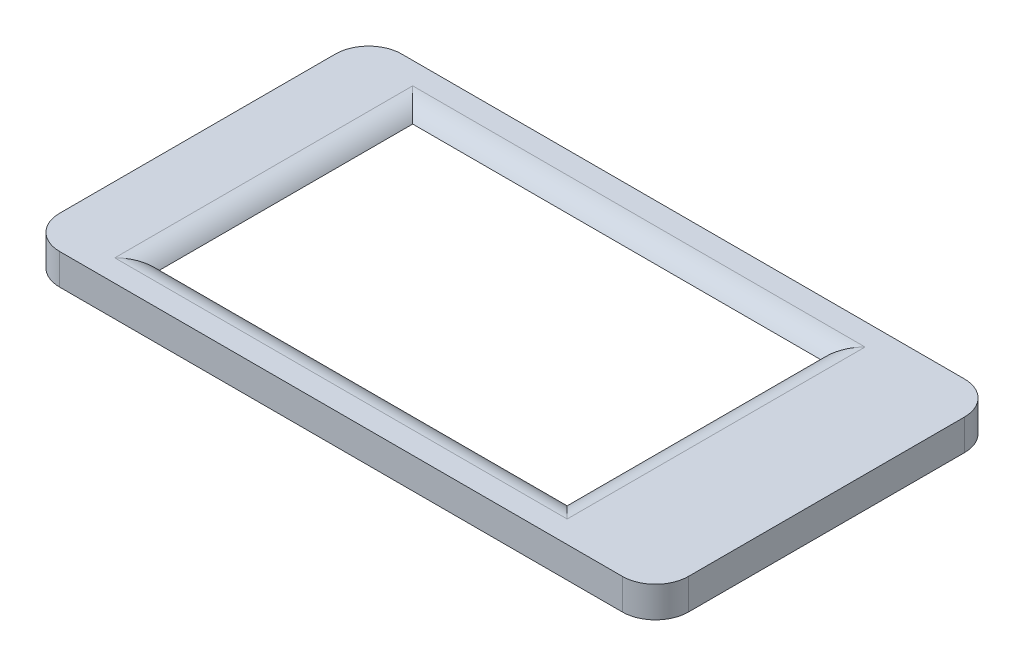
ISO-10303-21;
HEADER;
FILE_DESCRIPTION(('STEP AP214'),'2;1');
FILE_NAME('part.step','',(''),(''),'','','');
FILE_SCHEMA(('AUTOMOTIVE_DESIGN { 1 0 10303 214 1 1 1 1 }'));
ENDSEC;
DATA;
#1=APPLICATION_CONTEXT('core data for automotive mechanical design processes');
#2=APPLICATION_PROTOCOL_DEFINITION('international standard','automotive_design',2000,#1);
#3=PRODUCT_CONTEXT('',#1,'mechanical');
#4=PRODUCT('Part','Part','',(#3));
#5=PRODUCT_RELATED_PRODUCT_CATEGORY('part','',(#4));
#6=PRODUCT_DEFINITION_FORMATION('','',#4);
#7=PRODUCT_DEFINITION_CONTEXT('part definition',#1,'design');
#8=PRODUCT_DEFINITION('design','',#6,#7);
#9=PRODUCT_DEFINITION_SHAPE('','',#8);
#10=(LENGTH_UNIT() NAMED_UNIT(*) SI_UNIT(.MILLI.,.METRE.));
#11=(NAMED_UNIT(*) PLANE_ANGLE_UNIT() SI_UNIT($,.RADIAN.));
#12=(NAMED_UNIT(*) SI_UNIT($,.STERADIAN.) SOLID_ANGLE_UNIT());
#13=UNCERTAINTY_MEASURE_WITH_UNIT(LENGTH_MEASURE(1.E-05),#10,'distance_accuracy_value','');
#14=(GEOMETRIC_REPRESENTATION_CONTEXT(3) GLOBAL_UNCERTAINTY_ASSIGNED_CONTEXT((#13)) GLOBAL_UNIT_ASSIGNED_CONTEXT((#10,
#11,#12)) REPRESENTATION_CONTEXT('',''));
#15=CARTESIAN_POINT('',(0.,0.,0.));
#16=DIRECTION('',(0.,0.,1.));
#17=DIRECTION('',(1.,0.,0.));
#18=AXIS2_PLACEMENT_3D('',#15,#16,#17);
#19=CARTESIAN_POINT('',(55.,5.6,-31.));
#20=DIRECTION('',(-1.,0.,0.));
#21=DIRECTION('',(0.,0.,1.));
#22=AXIS2_PLACEMENT_3D('',#19,#20,#21);
#23=PLANE('',#22);
#24=DIRECTION('',(0.,0.,-1.));
#25=VECTOR('',#24,1.);
#26=CARTESIAN_POINT('',(55.,5.6,-31.));
#27=LINE('',#26,#25);
#28=CARTESIAN_POINT('',(55.,5.6,25.));
#29=VERTEX_POINT('',#28);
#30=CARTESIAN_POINT('',(55.,5.6,-25.));
#31=VERTEX_POINT('',#30);
#32=EDGE_CURVE('E239',#29,#31,#27,.T.);
#33=ORIENTED_EDGE('',*,*,#32,.F.);
#34=DIRECTION('',(0.,-1.,0.));
#35=VECTOR('',#34,1.);
#36=CARTESIAN_POINT('',(55.,5.6,25.));
#37=LINE('',#36,#35);
#38=CARTESIAN_POINT('',(55.,0.,25.));
#39=VERTEX_POINT('',#38);
#40=EDGE_CURVE('E11',#29,#39,#37,.T.);
#41=ORIENTED_EDGE('',*,*,#40,.T.);
#42=DIRECTION('',(0.,0.,-1.));
#43=VECTOR('',#42,1.);
#44=CARTESIAN_POINT('',(55.,0.,-31.));
#45=LINE('',#44,#43);
#46=CARTESIAN_POINT('',(55.,0.,-25.));
#47=VERTEX_POINT('',#46);
#48=EDGE_CURVE('E236',#39,#47,#45,.T.);
#49=ORIENTED_EDGE('',*,*,#48,.T.);
#50=DIRECTION('',(0.,-1.,0.));
#51=VECTOR('',#50,1.);
#52=CARTESIAN_POINT('',(55.,5.6,-25.));
#53=LINE('',#52,#51);
#54=EDGE_CURVE('E45',#47,#31,#53,.F.);
#55=ORIENTED_EDGE('',*,*,#54,.T.);
#56=EDGE_LOOP('',(#33,#41,#49,#55));
#57=FACE_BOUND('',#56,.T.);
#58=ADVANCED_FACE('F37',(#57),#23,.F.);
#59=CARTESIAN_POINT('',(-59.,5.6,-31.));
#60=DIRECTION('',(0.,0.,1.));
#61=DIRECTION('',(1.,0.,0.));
#62=AXIS2_PLACEMENT_3D('',#59,#60,#61);
#63=PLANE('',#62);
#64=DIRECTION('',(-1.,0.,0.));
#65=VECTOR('',#64,1.);
#66=CARTESIAN_POINT('',(-59.,0.,-31.));
#67=LINE('',#66,#65);
#68=CARTESIAN_POINT('',(49.,0.,-31.));
#69=VERTEX_POINT('',#68);
#70=CARTESIAN_POINT('',(-53.,0.,-31.));
#71=VERTEX_POINT('',#70);
#72=EDGE_CURVE('E253',#69,#71,#67,.T.);
#73=ORIENTED_EDGE('',*,*,#72,.T.);
#74=DIRECTION('',(0.,-1.,0.));
#75=VECTOR('',#74,1.);
#76=CARTESIAN_POINT('',(-53.,5.6,-31.));
#77=LINE('',#76,#75);
#78=CARTESIAN_POINT('',(-53.,5.6,-31.));
#79=VERTEX_POINT('',#78);
#80=EDGE_CURVE('E52',#71,#79,#77,.F.);
#81=ORIENTED_EDGE('',*,*,#80,.T.);
#82=DIRECTION('',(-1.,0.,0.));
#83=VECTOR('',#82,1.);
#84=CARTESIAN_POINT('',(-59.,5.6,-31.));
#85=LINE('',#84,#83);
#86=CARTESIAN_POINT('',(49.,5.6,-31.));
#87=VERTEX_POINT('',#86);
#88=EDGE_CURVE('E241',#87,#79,#85,.T.);
#89=ORIENTED_EDGE('',*,*,#88,.F.);
#90=DIRECTION('',(0.,-1.,0.));
#91=VECTOR('',#90,1.);
#92=CARTESIAN_POINT('',(49.,5.6,-31.));
#93=LINE('',#92,#91);
#94=EDGE_CURVE('E296',#87,#69,#93,.T.);
#95=ORIENTED_EDGE('',*,*,#94,.T.);
#96=EDGE_LOOP('',(#73,#81,#89,#95));
#97=FACE_BOUND('',#96,.T.);
#98=ADVANCED_FACE('F309',(#97),#63,.F.);
#99=CARTESIAN_POINT('',(-59.,5.6,-31.));
#100=DIRECTION('',(1.,0.,0.));
#101=DIRECTION('',(0.,0.,-1.));
#102=AXIS2_PLACEMENT_3D('',#99,#100,#101);
#103=PLANE('',#102);
#104=DIRECTION('',(0.,0.,1.));
#105=VECTOR('',#104,1.);
#106=CARTESIAN_POINT('',(-59.,0.,-31.));
#107=LINE('',#106,#105);
#108=CARTESIAN_POINT('',(-59.,0.,-25.));
#109=VERTEX_POINT('',#108);
#110=CARTESIAN_POINT('',(-59.,0.,25.));
#111=VERTEX_POINT('',#110);
#112=EDGE_CURVE('E255',#109,#111,#107,.T.);
#113=ORIENTED_EDGE('',*,*,#112,.T.);
#114=DIRECTION('',(0.,-1.,0.));
#115=VECTOR('',#114,1.);
#116=CARTESIAN_POINT('',(-59.,5.6,25.));
#117=LINE('',#116,#115);
#118=CARTESIAN_POINT('',(-59.,5.6,25.));
#119=VERTEX_POINT('',#118);
#120=EDGE_CURVE('E287',#111,#119,#117,.F.);
#121=ORIENTED_EDGE('',*,*,#120,.T.);
#122=DIRECTION('',(0.,0.,1.));
#123=VECTOR('',#122,1.);
#124=CARTESIAN_POINT('',(-59.,5.6,-31.));
#125=LINE('',#124,#123);
#126=CARTESIAN_POINT('',(-59.,5.6,-25.));
#127=VERTEX_POINT('',#126);
#128=EDGE_CURVE('E244',#127,#119,#125,.T.);
#129=ORIENTED_EDGE('',*,*,#128,.F.);
#130=DIRECTION('',(0.,-1.,0.));
#131=VECTOR('',#130,1.);
#132=CARTESIAN_POINT('',(-59.,5.6,-25.));
#133=LINE('',#132,#131);
#134=EDGE_CURVE('E284',#127,#109,#133,.T.);
#135=ORIENTED_EDGE('',*,*,#134,.T.);
#136=EDGE_LOOP('',(#113,#121,#129,#135));
#137=FACE_BOUND('',#136,.T.);
#138=ADVANCED_FACE('F320',(#137),#103,.F.);
#139=CARTESIAN_POINT('',(-59.,5.6,31.));
#140=DIRECTION('',(0.,0.,-1.));
#141=DIRECTION('',(-1.,0.,0.));
#142=AXIS2_PLACEMENT_3D('',#139,#140,#141);
#143=PLANE('',#142);
#144=DIRECTION('',(1.,0.,0.));
#145=VECTOR('',#144,1.);
#146=CARTESIAN_POINT('',(-59.,5.6,31.));
#147=LINE('',#146,#145);
#148=CARTESIAN_POINT('',(-53.,5.6,31.));
#149=VERTEX_POINT('',#148);
#150=CARTESIAN_POINT('',(49.,5.6,31.));
#151=VERTEX_POINT('',#150);
#152=EDGE_CURVE('E247',#149,#151,#147,.T.);
#153=ORIENTED_EDGE('',*,*,#152,.F.);
#154=DIRECTION('',(0.,-1.,0.));
#155=VECTOR('',#154,1.);
#156=CARTESIAN_POINT('',(-53.,5.6,31.));
#157=LINE('',#156,#155);
#158=CARTESIAN_POINT('',(-53.,0.,31.));
#159=VERTEX_POINT('',#158);
#160=EDGE_CURVE('E273',#149,#159,#157,.T.);
#161=ORIENTED_EDGE('',*,*,#160,.T.);
#162=DIRECTION('',(1.,0.,0.));
#163=VECTOR('',#162,1.);
#164=CARTESIAN_POINT('',(-59.,0.,31.));
#165=LINE('',#164,#163);
#166=CARTESIAN_POINT('',(49.,0.,31.));
#167=VERTEX_POINT('',#166);
#168=EDGE_CURVE('E242',#159,#167,#165,.T.);
#169=ORIENTED_EDGE('',*,*,#168,.T.);
#170=DIRECTION('',(0.,-1.,0.));
#171=VECTOR('',#170,1.);
#172=CARTESIAN_POINT('',(49.,5.6,31.));
#173=LINE('',#172,#171);
#174=EDGE_CURVE('E267',#167,#151,#173,.F.);
#175=ORIENTED_EDGE('',*,*,#174,.T.);
#176=EDGE_LOOP('',(#153,#161,#169,#175));
#177=FACE_BOUND('',#176,.T.);
#178=ADVANCED_FACE('F328',(#177),#143,.F.);
#179=CARTESIAN_POINT('',(0.,5.6,0.));
#180=DIRECTION('',(0.,1.,0.));
#181=DIRECTION('',(0.,0.,1.));
#182=AXIS2_PLACEMENT_3D('',#179,#180,#181);
#183=PLANE('',#182);
#184=DIRECTION('',(-1.,0.,0.));
#185=VECTOR('',#184,1.);
#186=CARTESIAN_POINT('',(-43.,5.6,27.));
#187=LINE('',#186,#185);
#188=CARTESIAN_POINT('',(35.,5.6,27.));
#189=VERTEX_POINT('',#188);
#190=CARTESIAN_POINT('',(-47.,5.6,27.));
#191=VERTEX_POINT('',#190);
#192=EDGE_CURVE('E262',#189,#191,#187,.T.);
#193=ORIENTED_EDGE('',*,*,#192,.T.);
#194=DIRECTION('',(0.,0.,-1.));
#195=VECTOR('',#194,1.);
#196=CARTESIAN_POINT('',(-47.,5.6,-23.));
#197=LINE('',#196,#195);
#198=CARTESIAN_POINT('',(-47.,5.6,-27.));
#199=VERTEX_POINT('',#198);
#200=EDGE_CURVE('E264',#191,#199,#197,.T.);
#201=ORIENTED_EDGE('',*,*,#200,.T.);
#202=DIRECTION('',(1.,0.,0.));
#203=VECTOR('',#202,1.);
#204=CARTESIAN_POINT('',(31.,5.6,-27.));
#205=LINE('',#204,#203);
#206=CARTESIAN_POINT('',(35.,5.6,-27.));
#207=VERTEX_POINT('',#206);
#208=EDGE_CURVE('E250',#199,#207,#205,.T.);
#209=ORIENTED_EDGE('',*,*,#208,.T.);
#210=DIRECTION('',(0.,0.,1.));
#211=VECTOR('',#210,1.);
#212=CARTESIAN_POINT('',(35.,5.6,23.));
#213=LINE('',#212,#211);
#214=EDGE_CURVE('E169',#207,#189,#213,.T.);
#215=ORIENTED_EDGE('',*,*,#214,.T.);
#216=EDGE_LOOP('',(#193,#201,#209,#215));
#217=FACE_BOUND('',#216,.T.);
#218=ORIENTED_EDGE('',*,*,#128,.T.);
#219=CARTESIAN_POINT('',(-53.,5.6,25.));
#220=DIRECTION('',(0.,1.,0.));
#221=DIRECTION('',(0.,0.,1.));
#222=AXIS2_PLACEMENT_3D('',#219,#220,#221);
#223=CIRCLE('',#222,6.);
#224=EDGE_CURVE('E294',#119,#149,#223,.T.);
#225=ORIENTED_EDGE('',*,*,#224,.T.);
#226=ORIENTED_EDGE('',*,*,#152,.T.);
#227=CARTESIAN_POINT('',(49.,5.6,25.));
#228=DIRECTION('',(0.,1.,0.));
#229=DIRECTION('',(0.,0.,1.));
#230=AXIS2_PLACEMENT_3D('',#227,#228,#229);
#231=CIRCLE('',#230,6.);
#232=EDGE_CURVE('E290',#151,#29,#231,.T.);
#233=ORIENTED_EDGE('',*,*,#232,.T.);
#234=ORIENTED_EDGE('',*,*,#32,.T.);
#235=CARTESIAN_POINT('',(49.,5.6,-25.));
#236=DIRECTION('',(0.,1.,0.));
#237=DIRECTION('',(0.,0.,1.));
#238=AXIS2_PLACEMENT_3D('',#235,#236,#237);
#239=CIRCLE('',#238,6.);
#240=EDGE_CURVE('E59',#31,#87,#239,.T.);
#241=ORIENTED_EDGE('',*,*,#240,.T.);
#242=ORIENTED_EDGE('',*,*,#88,.T.);
#243=CARTESIAN_POINT('',(-53.,5.6,-25.));
#244=DIRECTION('',(0.,1.,0.));
#245=DIRECTION('',(0.,0.,1.));
#246=AXIS2_PLACEMENT_3D('',#243,#244,#245);
#247=CIRCLE('',#246,6.);
#248=EDGE_CURVE('E292',#79,#127,#247,.T.);
#249=ORIENTED_EDGE('',*,*,#248,.T.);
#250=EDGE_LOOP('',(#218,#225,#226,#233,#234,#241,#242,#249));
#251=FACE_BOUND('',#250,.T.);
#252=ADVANCED_FACE('F305',(#217,#251),#183,.T.);
#253=CARTESIAN_POINT('',(0.,0.,0.));
#254=DIRECTION('',(0.,1.,0.));
#255=DIRECTION('',(0.,0.,1.));
#256=AXIS2_PLACEMENT_3D('',#253,#254,#255);
#257=PLANE('',#256);
#258=DIRECTION('',(-1.,0.,0.));
#259=VECTOR('',#258,1.);
#260=CARTESIAN_POINT('',(35.,0.,29.));
#261=LINE('',#260,#259);
#262=CARTESIAN_POINT('',(35.,0.,29.));
#263=VERTEX_POINT('',#262);
#264=CARTESIAN_POINT('',(-50.,0.,29.));
#265=VERTEX_POINT('',#264);
#266=EDGE_CURVE('E198',#263,#265,#261,.T.);
#267=ORIENTED_EDGE('',*,*,#266,.F.);
#268=DIRECTION('',(0.,0.,1.));
#269=VECTOR('',#268,1.);
#270=CARTESIAN_POINT('',(35.,0.,-29.));
#271=LINE('',#270,#269);
#272=CARTESIAN_POINT('',(35.,0.,-29.));
#273=VERTEX_POINT('',#272);
#274=EDGE_CURVE('E182',#273,#263,#271,.T.);
#275=ORIENTED_EDGE('',*,*,#274,.F.);
#276=DIRECTION('',(1.,0.,0.));
#277=VECTOR('',#276,1.);
#278=CARTESIAN_POINT('',(35.,0.,-29.));
#279=LINE('',#278,#277);
#280=CARTESIAN_POINT('',(-50.,0.,-29.));
#281=VERTEX_POINT('',#280);
#282=EDGE_CURVE('E187',#281,#273,#279,.T.);
#283=ORIENTED_EDGE('',*,*,#282,.F.);
#284=DIRECTION('',(0.,0.,-1.));
#285=VECTOR('',#284,1.);
#286=CARTESIAN_POINT('',(-50.,0.,-29.));
#287=LINE('',#286,#285);
#288=EDGE_CURVE('E201',#265,#281,#287,.T.);
#289=ORIENTED_EDGE('',*,*,#288,.F.);
#290=EDGE_LOOP('',(#267,#275,#283,#289));
#291=FACE_BOUND('',#290,.T.);
#292=CARTESIAN_POINT('',(39.,0.,-21.));
#293=DIRECTION('',(0.,-1.,0.));
#294=DIRECTION('',(0.,0.,1.));
#295=AXIS2_PLACEMENT_3D('',#292,#293,#294);
#296=CIRCLE('',#295,3.);
#297=CARTESIAN_POINT('',(39.,0.,-18.));
#298=VERTEX_POINT('',#297);
#299=EDGE_CURVE('E208',#298,#298,#296,.T.);
#300=ORIENTED_EDGE('',*,*,#299,.F.);
#301=EDGE_LOOP('',(#300));
#302=FACE_BOUND('',#301,.T.);
#303=CARTESIAN_POINT('',(39.,0.,21.));
#304=DIRECTION('',(0.,-1.,0.));
#305=DIRECTION('',(0.,0.,-1.));
#306=AXIS2_PLACEMENT_3D('',#303,#304,#305);
#307=CIRCLE('',#306,3.);
#308=CARTESIAN_POINT('',(39.,0.,18.));
#309=VERTEX_POINT('',#308);
#310=EDGE_CURVE('E218',#309,#309,#307,.T.);
#311=ORIENTED_EDGE('',*,*,#310,.F.);
#312=EDGE_LOOP('',(#311));
#313=FACE_BOUND('',#312,.T.);
#314=CARTESIAN_POINT('',(-54.,0.,-21.));
#315=DIRECTION('',(0.,-1.,0.));
#316=DIRECTION('',(0.,0.,1.));
#317=AXIS2_PLACEMENT_3D('',#314,#315,#316);
#318=CIRCLE('',#317,3.);
#319=CARTESIAN_POINT('',(-54.,0.,-18.));
#320=VERTEX_POINT('',#319);
#321=EDGE_CURVE('E224',#320,#320,#318,.T.);
#322=ORIENTED_EDGE('',*,*,#321,.F.);
#323=EDGE_LOOP('',(#322));
#324=FACE_BOUND('',#323,.T.);
#325=CARTESIAN_POINT('',(-54.,0.,21.));
#326=DIRECTION('',(0.,-1.,0.));
#327=DIRECTION('',(0.,0.,-1.));
#328=AXIS2_PLACEMENT_3D('',#325,#326,#327);
#329=CIRCLE('',#328,3.);
#330=CARTESIAN_POINT('',(-54.,0.,18.));
#331=VERTEX_POINT('',#330);
#332=EDGE_CURVE('E230',#331,#331,#329,.T.);
#333=ORIENTED_EDGE('',*,*,#332,.F.);
#334=EDGE_LOOP('',(#333));
#335=FACE_BOUND('',#334,.T.);
#336=ORIENTED_EDGE('',*,*,#168,.F.);
#337=CARTESIAN_POINT('',(-53.,0.,25.));
#338=DIRECTION('',(0.,1.,0.));
#339=DIRECTION('',(0.,0.,1.));
#340=AXIS2_PLACEMENT_3D('',#337,#338,#339);
#341=CIRCLE('',#340,6.);
#342=EDGE_CURVE('E282',#159,#111,#341,.F.);
#343=ORIENTED_EDGE('',*,*,#342,.T.);
#344=ORIENTED_EDGE('',*,*,#112,.F.);
#345=CARTESIAN_POINT('',(-53.,0.,-25.));
#346=DIRECTION('',(0.,1.,0.));
#347=DIRECTION('',(0.,0.,1.));
#348=AXIS2_PLACEMENT_3D('',#345,#346,#347);
#349=CIRCLE('',#348,6.);
#350=EDGE_CURVE('E280',#109,#71,#349,.F.);
#351=ORIENTED_EDGE('',*,*,#350,.T.);
#352=ORIENTED_EDGE('',*,*,#72,.F.);
#353=CARTESIAN_POINT('',(49.,0.,-25.));
#354=DIRECTION('',(0.,1.,0.));
#355=DIRECTION('',(0.,0.,1.));
#356=AXIS2_PLACEMENT_3D('',#353,#354,#355);
#357=CIRCLE('',#356,6.);
#358=EDGE_CURVE('E276',#69,#47,#357,.F.);
#359=ORIENTED_EDGE('',*,*,#358,.T.);
#360=ORIENTED_EDGE('',*,*,#48,.F.);
#361=CARTESIAN_POINT('',(49.,0.,25.));
#362=DIRECTION('',(0.,1.,0.));
#363=DIRECTION('',(0.,0.,1.));
#364=AXIS2_PLACEMENT_3D('',#361,#362,#363);
#365=CIRCLE('',#364,6.);
#366=EDGE_CURVE('E278',#39,#167,#365,.F.);
#367=ORIENTED_EDGE('',*,*,#366,.T.);
#368=EDGE_LOOP('',(#336,#343,#344,#351,#352,#359,#360,#367));
#369=FACE_BOUND('',#368,.T.);
#370=ADVANCED_FACE('F312',(#291,#302,#313,#324,#335,#369),#257,.F.);
#371=CARTESIAN_POINT('',(-54.,3.,21.));
#372=DIRECTION('',(0.,-1.,0.));
#373=DIRECTION('',(0.,0.,-1.));
#374=AXIS2_PLACEMENT_3D('',#371,#372,#373);
#375=CYLINDRICAL_SURFACE('',#374,3.);
#376=CARTESIAN_POINT('',(-54.,3.,21.));
#377=DIRECTION('',(0.,-1.,0.));
#378=DIRECTION('',(0.,0.,-1.));
#379=AXIS2_PLACEMENT_3D('',#376,#377,#378);
#380=CIRCLE('',#379,3.);
#381=CARTESIAN_POINT('',(-54.,3.,18.));
#382=VERTEX_POINT('',#381);
#383=EDGE_CURVE('E233',#382,#382,#380,.T.);
#384=ORIENTED_EDGE('',*,*,#383,.F.);
#385=EDGE_LOOP('',(#384));
#386=FACE_BOUND('',#385,.T.);
#387=ORIENTED_EDGE('',*,*,#332,.T.);
#388=EDGE_LOOP('',(#387));
#389=FACE_BOUND('',#388,.T.);
#390=ADVANCED_FACE('F507',(#386,#389),#375,.F.);
#391=CARTESIAN_POINT('',(-54.,3.,21.));
#392=DIRECTION('',(0.,-1.,0.));
#393=DIRECTION('',(0.,0.,-1.));
#394=AXIS2_PLACEMENT_3D('',#391,#392,#393);
#395=PLANE('',#394);
#396=ORIENTED_EDGE('',*,*,#383,.T.);
#397=EDGE_LOOP('',(#396));
#398=FACE_BOUND('',#397,.T.);
#399=ADVANCED_FACE('F498',(#398),#395,.T.);
#400=CARTESIAN_POINT('',(-54.,3.,-21.));
#401=DIRECTION('',(0.,-1.,0.));
#402=DIRECTION('',(0.,0.,-1.));
#403=AXIS2_PLACEMENT_3D('',#400,#401,#402);
#404=CYLINDRICAL_SURFACE('',#403,3.);
#405=CARTESIAN_POINT('',(-54.,3.,-21.));
#406=DIRECTION('',(0.,-1.,0.));
#407=DIRECTION('',(0.,0.,1.));
#408=AXIS2_PLACEMENT_3D('',#405,#406,#407);
#409=CIRCLE('',#408,3.);
#410=CARTESIAN_POINT('',(-54.,3.,-18.));
#411=VERTEX_POINT('',#410);
#412=EDGE_CURVE('E227',#411,#411,#409,.T.);
#413=ORIENTED_EDGE('',*,*,#412,.F.);
#414=EDGE_LOOP('',(#413));
#415=FACE_BOUND('',#414,.T.);
#416=ORIENTED_EDGE('',*,*,#321,.T.);
#417=EDGE_LOOP('',(#416));
#418=FACE_BOUND('',#417,.T.);
#419=ADVANCED_FACE('F489',(#415,#418),#404,.F.);
#420=CARTESIAN_POINT('',(-54.,3.,-21.));
#421=DIRECTION('',(0.,1.,0.));
#422=DIRECTION('',(0.,0.,1.));
#423=AXIS2_PLACEMENT_3D('',#420,#421,#422);
#424=PLANE('',#423);
#425=ORIENTED_EDGE('',*,*,#412,.T.);
#426=EDGE_LOOP('',(#425));
#427=FACE_BOUND('',#426,.T.);
#428=ADVANCED_FACE('F480',(#427),#424,.F.);
#429=CARTESIAN_POINT('',(39.,3.,21.));
#430=DIRECTION('',(0.,-1.,0.));
#431=DIRECTION('',(0.,0.,-1.));
#432=AXIS2_PLACEMENT_3D('',#429,#430,#431);
#433=CYLINDRICAL_SURFACE('',#432,3.);
#434=CARTESIAN_POINT('',(39.,3.,21.));
#435=DIRECTION('',(0.,-1.,0.));
#436=DIRECTION('',(0.,0.,-1.));
#437=AXIS2_PLACEMENT_3D('',#434,#435,#436);
#438=CIRCLE('',#437,3.);
#439=CARTESIAN_POINT('',(39.,3.,18.));
#440=VERTEX_POINT('',#439);
#441=EDGE_CURVE('E221',#440,#440,#438,.T.);
#442=ORIENTED_EDGE('',*,*,#441,.F.);
#443=EDGE_LOOP('',(#442));
#444=FACE_BOUND('',#443,.T.);
#445=ORIENTED_EDGE('',*,*,#310,.T.);
#446=EDGE_LOOP('',(#445));
#447=FACE_BOUND('',#446,.T.);
#448=ADVANCED_FACE('F471',(#444,#447),#433,.F.);
#449=CARTESIAN_POINT('',(39.,3.,21.));
#450=DIRECTION('',(0.,-1.,0.));
#451=DIRECTION('',(0.,0.,-1.));
#452=AXIS2_PLACEMENT_3D('',#449,#450,#451);
#453=PLANE('',#452);
#454=ORIENTED_EDGE('',*,*,#441,.T.);
#455=EDGE_LOOP('',(#454));
#456=FACE_BOUND('',#455,.T.);
#457=ADVANCED_FACE('F462',(#456),#453,.T.);
#458=CARTESIAN_POINT('',(39.,3.,-21.));
#459=DIRECTION('',(0.,-1.,0.));
#460=DIRECTION('',(0.,0.,-1.));
#461=AXIS2_PLACEMENT_3D('',#458,#459,#460);
#462=CYLINDRICAL_SURFACE('',#461,3.);
#463=CARTESIAN_POINT('',(39.,3.,-21.));
#464=DIRECTION('',(0.,-1.,0.));
#465=DIRECTION('',(0.,0.,1.));
#466=AXIS2_PLACEMENT_3D('',#463,#464,#465);
#467=CIRCLE('',#466,3.);
#468=CARTESIAN_POINT('',(39.,3.,-18.));
#469=VERTEX_POINT('',#468);
#470=EDGE_CURVE('E215',#469,#469,#467,.T.);
#471=ORIENTED_EDGE('',*,*,#470,.F.);
#472=EDGE_LOOP('',(#471));
#473=FACE_BOUND('',#472,.T.);
#474=ORIENTED_EDGE('',*,*,#299,.T.);
#475=EDGE_LOOP('',(#474));
#476=FACE_BOUND('',#475,.T.);
#477=ADVANCED_FACE('F453',(#473,#476),#462,.F.);
#478=CARTESIAN_POINT('',(39.,3.,-21.));
#479=DIRECTION('',(0.,1.,0.));
#480=DIRECTION('',(0.,0.,1.));
#481=AXIS2_PLACEMENT_3D('',#478,#479,#480);
#482=PLANE('',#481);
#483=ORIENTED_EDGE('',*,*,#470,.T.);
#484=EDGE_LOOP('',(#483));
#485=FACE_BOUND('',#484,.T.);
#486=ADVANCED_FACE('F444',(#485),#482,.F.);
#487=CARTESIAN_POINT('',(35.,3.6,-29.));
#488=DIRECTION('',(1.,0.,0.));
#489=DIRECTION('',(0.,0.,-1.));
#490=AXIS2_PLACEMENT_3D('',#487,#488,#489);
#491=PLANE('',#490);
#492=ORIENTED_EDGE('',*,*,#274,.T.);
#493=DIRECTION('',(0.,-1.,0.));
#494=VECTOR('',#493,1.);
#495=CARTESIAN_POINT('',(35.,3.6,29.));
#496=LINE('',#495,#494);
#497=CARTESIAN_POINT('',(35.,3.6,29.));
#498=VERTEX_POINT('',#497);
#499=EDGE_CURVE('E196',#498,#263,#496,.T.);
#500=ORIENTED_EDGE('',*,*,#499,.F.);
#501=DIRECTION('',(0.,0.,1.));
#502=VECTOR('',#501,1.);
#503=CARTESIAN_POINT('',(35.,3.6,-29.));
#504=LINE('',#503,#502);
#505=CARTESIAN_POINT('',(35.,3.6,-29.));
#506=VERTEX_POINT('',#505);
#507=EDGE_CURVE('E183',#506,#498,#504,.T.);
#508=ORIENTED_EDGE('',*,*,#507,.F.);
#509=DIRECTION('',(0.,-1.,0.));
#510=VECTOR('',#509,1.);
#511=CARTESIAN_POINT('',(35.,3.6,-29.));
#512=LINE('',#511,#510);
#513=EDGE_CURVE('E206',#506,#273,#512,.T.);
#514=ORIENTED_EDGE('',*,*,#513,.T.);
#515=EDGE_LOOP('',(#492,#500,#508,#514));
#516=FACE_BOUND('',#515,.T.);
#517=ADVANCED_FACE('F435',(#516),#491,.F.);
#518=CARTESIAN_POINT('',(35.,3.6,-29.));
#519=DIRECTION('',(0.,0.,-1.));
#520=DIRECTION('',(-1.,0.,0.));
#521=AXIS2_PLACEMENT_3D('',#518,#519,#520);
#522=PLANE('',#521);
#523=ORIENTED_EDGE('',*,*,#282,.T.);
#524=ORIENTED_EDGE('',*,*,#513,.F.);
#525=DIRECTION('',(1.,0.,0.));
#526=VECTOR('',#525,1.);
#527=CARTESIAN_POINT('',(35.,3.6,-29.));
#528=LINE('',#527,#526);
#529=CARTESIAN_POINT('',(-50.,3.6,-29.));
#530=VERTEX_POINT('',#529);
#531=EDGE_CURVE('E193',#530,#506,#528,.T.);
#532=ORIENTED_EDGE('',*,*,#531,.F.);
#533=DIRECTION('',(0.,-1.,0.));
#534=VECTOR('',#533,1.);
#535=CARTESIAN_POINT('',(-50.,3.6,-29.));
#536=LINE('',#535,#534);
#537=EDGE_CURVE('E209',#530,#281,#536,.T.);
#538=ORIENTED_EDGE('',*,*,#537,.T.);
#539=EDGE_LOOP('',(#523,#524,#532,#538));
#540=FACE_BOUND('',#539,.T.);
#541=ADVANCED_FACE('F426',(#540),#522,.F.);
#542=CARTESIAN_POINT('',(-50.,3.6,-29.));
#543=DIRECTION('',(-1.,0.,0.));
#544=DIRECTION('',(0.,0.,1.));
#545=AXIS2_PLACEMENT_3D('',#542,#543,#544);
#546=PLANE('',#545);
#547=ORIENTED_EDGE('',*,*,#288,.T.);
#548=ORIENTED_EDGE('',*,*,#537,.F.);
#549=DIRECTION('',(0.,0.,-1.));
#550=VECTOR('',#549,1.);
#551=CARTESIAN_POINT('',(-50.,3.6,-29.));
#552=LINE('',#551,#550);
#553=CARTESIAN_POINT('',(-50.,3.6,29.));
#554=VERTEX_POINT('',#553);
#555=EDGE_CURVE('E190',#554,#530,#552,.T.);
#556=ORIENTED_EDGE('',*,*,#555,.F.);
#557=DIRECTION('',(0.,-1.,0.));
#558=VECTOR('',#557,1.);
#559=CARTESIAN_POINT('',(-50.,3.6,29.));
#560=LINE('',#559,#558);
#561=EDGE_CURVE('E211',#554,#265,#560,.T.);
#562=ORIENTED_EDGE('',*,*,#561,.T.);
#563=EDGE_LOOP('',(#547,#548,#556,#562));
#564=FACE_BOUND('',#563,.T.);
#565=ADVANCED_FACE('F417',(#564),#546,.F.);
#566=CARTESIAN_POINT('',(35.,3.6,29.));
#567=DIRECTION('',(0.,0.,1.));
#568=DIRECTION('',(1.,0.,0.));
#569=AXIS2_PLACEMENT_3D('',#566,#567,#568);
#570=PLANE('',#569);
#571=ORIENTED_EDGE('',*,*,#266,.T.);
#572=ORIENTED_EDGE('',*,*,#561,.F.);
#573=DIRECTION('',(-1.,0.,0.));
#574=VECTOR('',#573,1.);
#575=CARTESIAN_POINT('',(35.,3.6,29.));
#576=LINE('',#575,#574);
#577=EDGE_CURVE('E186',#498,#554,#576,.T.);
#578=ORIENTED_EDGE('',*,*,#577,.F.);
#579=ORIENTED_EDGE('',*,*,#499,.T.);
#580=EDGE_LOOP('',(#571,#572,#578,#579));
#581=FACE_BOUND('',#580,.T.);
#582=ADVANCED_FACE('F409',(#581),#570,.F.);
#583=CARTESIAN_POINT('',(0.,3.6,0.));
#584=DIRECTION('',(0.,-1.,0.));
#585=DIRECTION('',(0.,0.,-1.));
#586=AXIS2_PLACEMENT_3D('',#583,#584,#585);
#587=PLANE('',#586);
#588=DIRECTION('',(0.,0.,-1.));
#589=VECTOR('',#588,1.);
#590=CARTESIAN_POINT('',(-43.,3.6,23.));
#591=LINE('',#590,#589);
#592=CARTESIAN_POINT('',(-43.,3.6,23.));
#593=VERTEX_POINT('',#592);
#594=CARTESIAN_POINT('',(-43.,3.6,-23.));
#595=VERTEX_POINT('',#594);
#596=EDGE_CURVE('E172',#593,#595,#591,.T.);
#597=ORIENTED_EDGE('',*,*,#596,.F.);
#598=DIRECTION('',(-1.,0.,0.));
#599=VECTOR('',#598,1.);
#600=CARTESIAN_POINT('',(31.,3.6,23.));
#601=LINE('',#600,#599);
#602=CARTESIAN_POINT('',(31.,3.6,23.));
#603=VERTEX_POINT('',#602);
#604=EDGE_CURVE('E160',#603,#593,#601,.T.);
#605=ORIENTED_EDGE('',*,*,#604,.F.);
#606=DIRECTION('',(0.,0.,1.));
#607=VECTOR('',#606,1.);
#608=CARTESIAN_POINT('',(31.,3.6,23.));
#609=LINE('',#608,#607);
#610=CARTESIAN_POINT('',(31.,3.6,-23.));
#611=VERTEX_POINT('',#610);
#612=EDGE_CURVE('E151',#611,#603,#609,.T.);
#613=ORIENTED_EDGE('',*,*,#612,.F.);
#614=DIRECTION('',(1.,0.,0.));
#615=VECTOR('',#614,1.);
#616=CARTESIAN_POINT('',(31.,3.6,-23.));
#617=LINE('',#616,#615);
#618=EDGE_CURVE('E157',#595,#611,#617,.T.);
#619=ORIENTED_EDGE('',*,*,#618,.F.);
#620=EDGE_LOOP('',(#597,#605,#613,#619));
#621=FACE_BOUND('',#620,.T.);
#622=ORIENTED_EDGE('',*,*,#507,.T.);
#623=ORIENTED_EDGE('',*,*,#577,.T.);
#624=ORIENTED_EDGE('',*,*,#555,.T.);
#625=ORIENTED_EDGE('',*,*,#531,.T.);
#626=EDGE_LOOP('',(#622,#623,#624,#625));
#627=FACE_BOUND('',#626,.T.);
#628=ADVANCED_FACE('F154',(#621,#627),#587,.T.);
#629=CARTESIAN_POINT('',(35.,0.6,23.));
#630=DIRECTION('',(0.,0.,-1.));
#631=DIRECTION('',(-1.,0.,0.));
#632=AXIS2_PLACEMENT_3D('',#629,#630,#631);
#633=CYLINDRICAL_SURFACE('',#632,5.);
#634=CARTESIAN_POINT('',(35.,0.6,27.));
#635=DIRECTION('',(0.707106781186548,0.,-0.707106781186547));
#636=DIRECTION('',(0.707106781186547,0.,0.707106781186548));
#637=AXIS2_PLACEMENT_3D('',#634,#635,#636);
#638=ELLIPSE('',#637,7.07106781186547,5.);
#639=EDGE_CURVE('E173',#189,#603,#638,.F.);
#640=ORIENTED_EDGE('',*,*,#639,.F.);
#641=ORIENTED_EDGE('',*,*,#214,.F.);
#642=CARTESIAN_POINT('',(35.,0.6,-27.));
#643=DIRECTION('',(-0.707106781186547,0.,-0.707106781186548));
#644=DIRECTION('',(0.707106781186548,0.,-0.707106781186547));
#645=AXIS2_PLACEMENT_3D('',#642,#643,#644);
#646=ELLIPSE('',#645,7.07106781186547,5.);
#647=EDGE_CURVE('E167',#611,#207,#646,.T.);
#648=ORIENTED_EDGE('',*,*,#647,.F.);
#649=ORIENTED_EDGE('',*,*,#612,.T.);
#650=EDGE_LOOP('',(#640,#641,#648,#649));
#651=FACE_BOUND('',#650,.T.);
#652=ADVANCED_FACE('F168',(#651),#633,.T.);
#653=CARTESIAN_POINT('',(31.,0.6,-27.));
#654=DIRECTION('',(-1.,0.,0.));
#655=DIRECTION('',(0.,0.,1.));
#656=AXIS2_PLACEMENT_3D('',#653,#654,#655);
#657=CYLINDRICAL_SURFACE('',#656,5.);
#658=ORIENTED_EDGE('',*,*,#647,.T.);
#659=ORIENTED_EDGE('',*,*,#208,.F.);
#660=CARTESIAN_POINT('',(-47.,0.6,-27.));
#661=DIRECTION('',(-0.707106781186548,0.,0.707106781186547));
#662=DIRECTION('',(0.707106781186547,0.,0.707106781186548));
#663=AXIS2_PLACEMENT_3D('',#660,#661,#662);
#664=ELLIPSE('',#663,7.07106781186548,5.);
#665=EDGE_CURVE('E176',#595,#199,#664,.T.);
#666=ORIENTED_EDGE('',*,*,#665,.F.);
#667=ORIENTED_EDGE('',*,*,#618,.T.);
#668=EDGE_LOOP('',(#658,#659,#666,#667));
#669=FACE_BOUND('',#668,.T.);
#670=ADVANCED_FACE('F175',(#669),#657,.T.);
#671=CARTESIAN_POINT('',(31.,0.6,27.));
#672=DIRECTION('',(1.,0.,0.));
#673=DIRECTION('',(0.,0.,-1.));
#674=AXIS2_PLACEMENT_3D('',#671,#672,#673);
#675=CYLINDRICAL_SURFACE('',#674,5.);
#676=ORIENTED_EDGE('',*,*,#639,.T.);
#677=ORIENTED_EDGE('',*,*,#604,.T.);
#678=CARTESIAN_POINT('',(-47.,0.6,27.));
#679=DIRECTION('',(0.707106781186547,0.,0.707106781186548));
#680=DIRECTION('',(-0.707106781186548,0.,0.707106781186547));
#681=AXIS2_PLACEMENT_3D('',#678,#679,#680);
#682=ELLIPSE('',#681,7.07106781186547,5.);
#683=EDGE_CURVE('E268',#191,#593,#682,.F.);
#684=ORIENTED_EDGE('',*,*,#683,.F.);
#685=ORIENTED_EDGE('',*,*,#192,.F.);
#686=EDGE_LOOP('',(#676,#677,#684,#685));
#687=FACE_BOUND('',#686,.T.);
#688=ADVANCED_FACE('F349',(#687),#675,.T.);
#689=CARTESIAN_POINT('',(-47.,0.6,23.));
#690=DIRECTION('',(0.,0.,1.));
#691=DIRECTION('',(1.,0.,0.));
#692=AXIS2_PLACEMENT_3D('',#689,#690,#691);
#693=CYLINDRICAL_SURFACE('',#692,5.);
#694=ORIENTED_EDGE('',*,*,#665,.T.);
#695=ORIENTED_EDGE('',*,*,#200,.F.);
#696=ORIENTED_EDGE('',*,*,#683,.T.);
#697=ORIENTED_EDGE('',*,*,#596,.T.);
#698=EDGE_LOOP('',(#694,#695,#696,#697));
#699=FACE_BOUND('',#698,.T.);
#700=ADVANCED_FACE('F346',(#699),#693,.T.);
#701=CARTESIAN_POINT('',(-53.,5.6,25.));
#702=DIRECTION('',(0.,-1.,0.));
#703=DIRECTION('',(0.,0.,-1.));
#704=AXIS2_PLACEMENT_3D('',#701,#702,#703);
#705=CYLINDRICAL_SURFACE('',#704,6.);
#706=ORIENTED_EDGE('',*,*,#224,.F.);
#707=ORIENTED_EDGE('',*,*,#120,.F.);
#708=ORIENTED_EDGE('',*,*,#342,.F.);
#709=ORIENTED_EDGE('',*,*,#160,.F.);
#710=EDGE_LOOP('',(#706,#707,#708,#709));
#711=FACE_BOUND('',#710,.T.);
#712=ADVANCED_FACE('F326',(#711),#705,.T.);
#713=CARTESIAN_POINT('',(-53.,5.6,-25.));
#714=DIRECTION('',(0.,-1.,0.));
#715=DIRECTION('',(0.,0.,-1.));
#716=AXIS2_PLACEMENT_3D('',#713,#714,#715);
#717=CYLINDRICAL_SURFACE('',#716,6.);
#718=ORIENTED_EDGE('',*,*,#248,.F.);
#719=ORIENTED_EDGE('',*,*,#80,.F.);
#720=ORIENTED_EDGE('',*,*,#350,.F.);
#721=ORIENTED_EDGE('',*,*,#134,.F.);
#722=EDGE_LOOP('',(#718,#719,#720,#721));
#723=FACE_BOUND('',#722,.T.);
#724=ADVANCED_FACE('F317',(#723),#717,.T.);
#725=CARTESIAN_POINT('',(49.,5.6,25.));
#726=DIRECTION('',(0.,-1.,0.));
#727=DIRECTION('',(0.,0.,-1.));
#728=AXIS2_PLACEMENT_3D('',#725,#726,#727);
#729=CYLINDRICAL_SURFACE('',#728,6.);
#730=ORIENTED_EDGE('',*,*,#232,.F.);
#731=ORIENTED_EDGE('',*,*,#174,.F.);
#732=ORIENTED_EDGE('',*,*,#366,.F.);
#733=ORIENTED_EDGE('',*,*,#40,.F.);
#734=EDGE_LOOP('',(#730,#731,#732,#733));
#735=FACE_BOUND('',#734,.T.);
#736=ADVANCED_FACE('F331',(#735),#729,.T.);
#737=CARTESIAN_POINT('',(49.,5.6,-25.));
#738=DIRECTION('',(0.,-1.,0.));
#739=DIRECTION('',(0.,0.,-1.));
#740=AXIS2_PLACEMENT_3D('',#737,#738,#739);
#741=CYLINDRICAL_SURFACE('',#740,6.);
#742=ORIENTED_EDGE('',*,*,#240,.F.);
#743=ORIENTED_EDGE('',*,*,#54,.F.);
#744=ORIENTED_EDGE('',*,*,#358,.F.);
#745=ORIENTED_EDGE('',*,*,#94,.F.);
#746=EDGE_LOOP('',(#742,#743,#744,#745));
#747=FACE_BOUND('',#746,.T.);
#748=ADVANCED_FACE('F39',(#747),#741,.T.);
#749=CLOSED_SHELL('',(#58,#98,#138,#178,#252,#370,#390,#399,#419,#428,#448,#457,#477,#486,#517,
#541,#565,#582,#628,#652,#670,#688,#700,#712,#724,#736,#748));
#750=MANIFOLD_SOLID_BREP('B2',#749);
#751=ADVANCED_BREP_SHAPE_REPRESENTATION('',(#18,#750),#14);
#752=SHAPE_DEFINITION_REPRESENTATION(#9,#751);
ENDSEC;
END-ISO-10303-21;
